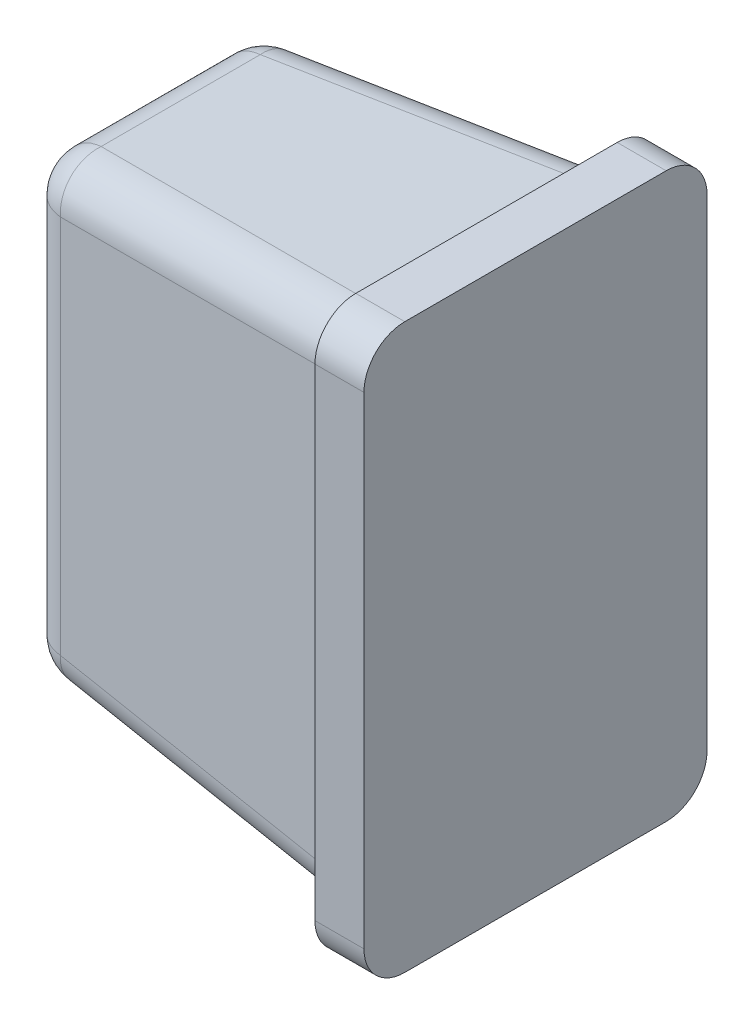
ISO-10303-21;
HEADER;
FILE_DESCRIPTION(('STEP AP214'),'2;1');
FILE_NAME('part.step','',(''),(''),'','','');
FILE_SCHEMA(('AUTOMOTIVE_DESIGN { 1 0 10303 214 1 1 1 1 }'));
ENDSEC;
DATA;
#1=APPLICATION_CONTEXT('core data for automotive mechanical design processes');
#2=APPLICATION_PROTOCOL_DEFINITION('international standard','automotive_design',2000,#1);
#3=PRODUCT_CONTEXT('',#1,'mechanical');
#4=PRODUCT('Part','Part','',(#3));
#5=PRODUCT_RELATED_PRODUCT_CATEGORY('part','',(#4));
#6=PRODUCT_DEFINITION_FORMATION('','',#4);
#7=PRODUCT_DEFINITION_CONTEXT('part definition',#1,'design');
#8=PRODUCT_DEFINITION('design','',#6,#7);
#9=PRODUCT_DEFINITION_SHAPE('','',#8);
#10=(LENGTH_UNIT() NAMED_UNIT(*) SI_UNIT(.MILLI.,.METRE.));
#11=(NAMED_UNIT(*) PLANE_ANGLE_UNIT() SI_UNIT($,.RADIAN.));
#12=(NAMED_UNIT(*) SI_UNIT($,.STERADIAN.) SOLID_ANGLE_UNIT());
#13=UNCERTAINTY_MEASURE_WITH_UNIT(LENGTH_MEASURE(1.E-05),#10,'distance_accuracy_value','');
#14=(GEOMETRIC_REPRESENTATION_CONTEXT(3) GLOBAL_UNCERTAINTY_ASSIGNED_CONTEXT((#13)) GLOBAL_UNIT_ASSIGNED_CONTEXT((#10,
#11,#12)) REPRESENTATION_CONTEXT('',''));
#15=CARTESIAN_POINT('',(0.,0.,0.));
#16=DIRECTION('',(0.,0.,1.));
#17=DIRECTION('',(1.,0.,0.));
#18=AXIS2_PLACEMENT_3D('',#15,#16,#17);
#19=CARTESIAN_POINT('',(-14.4,2.32438202618241,-38.9256179738176));
#20=DIRECTION('',(1.,0.,0.));
#21=DIRECTION('',(0.,0.,-1.));
#22=AXIS2_PLACEMENT_3D('',#19,#20,#21);
#23=SPHERICAL_SURFACE('',#22,0.5);
#24=CARTESIAN_POINT('',(-14.4,2.32438202618241,-38.9256179738176));
#25=DIRECTION('',(0.,0.,-1.));
#26=DIRECTION('',(-1.,0.,0.));
#27=AXIS2_PLACEMENT_3D('',#24,#25,#26);
#28=CIRCLE('',#27,0.5);
#29=CARTESIAN_POINT('',(-14.9,2.32438202618241,-38.9256179738176));
#30=VERTEX_POINT('',#29);
#31=CARTESIAN_POINT('',(-14.4435778713738,2.82247937522828,-38.9256179738176));
#32=VERTEX_POINT('',#31);
#33=EDGE_CURVE('E141',#30,#32,#28,.T.);
#34=ORIENTED_EDGE('',*,*,#33,.F.);
#35=CARTESIAN_POINT('',(-14.4,2.32438202618241,-38.9256179738176));
#36=DIRECTION('',(0.,1.,0.));
#37=DIRECTION('',(0.,0.,1.));
#38=AXIS2_PLACEMENT_3D('',#35,#36,#37);
#39=CIRCLE('',#38,0.5);
#40=CARTESIAN_POINT('',(-14.4435778713738,2.32438202618241,-38.4275206247717));
#41=VERTEX_POINT('',#40);
#42=EDGE_CURVE('E234',#41,#30,#39,.F.);
#43=ORIENTED_EDGE('',*,*,#42,.F.);
#44=CARTESIAN_POINT('',(-14.4,2.32438202618241,-38.9256179738176));
#45=DIRECTION('',(0.992432509138967,0.0868265938642478,0.0868265938642478));
#46=DIRECTION('',(0.0871557427476584,0.,-0.996194698091746));
#47=AXIS2_PLACEMENT_3D('',#44,#45,#46);
#48=CIRCLE('',#47,0.499999999999999);
#49=EDGE_CURVE('E140',#32,#41,#48,.T.);
#50=ORIENTED_EDGE('',*,*,#49,.F.);
#51=EDGE_LOOP('',(#34,#43,#50));
#52=FACE_BOUND('',#51,.T.);
#53=ADVANCED_FACE('F17',(#52),#23,.T.);
#54=CARTESIAN_POINT('',(-14.4,-2.32438202618241,-38.9256179738176));
#55=DIRECTION('',(1.,0.,0.));
#56=DIRECTION('',(0.,0.,-1.));
#57=AXIS2_PLACEMENT_3D('',#54,#55,#56);
#58=SPHERICAL_SURFACE('',#57,0.5);
#59=CARTESIAN_POINT('',(-14.4,-2.32438202618241,-38.9256179738176));
#60=DIRECTION('',(0.992432509138967,-0.0868265938642478,0.0868265938642478));
#61=DIRECTION('',(0.0871557427476584,0.,-0.996194698091746));
#62=AXIS2_PLACEMENT_3D('',#59,#60,#61);
#63=CIRCLE('',#62,0.499999999999999);
#64=CARTESIAN_POINT('',(-14.4435778713738,-2.3243820261824,-38.4275206247717));
#65=VERTEX_POINT('',#64);
#66=CARTESIAN_POINT('',(-14.4435778713738,-2.82247937522828,-38.9256179738176));
#67=VERTEX_POINT('',#66);
#68=EDGE_CURVE('E214',#65,#67,#63,.T.);
#69=ORIENTED_EDGE('',*,*,#68,.F.);
#70=CARTESIAN_POINT('',(-14.4,-2.32438202618241,-38.9256179738176));
#71=DIRECTION('',(0.,1.,0.));
#72=DIRECTION('',(0.,0.,1.));
#73=AXIS2_PLACEMENT_3D('',#70,#71,#72);
#74=CIRCLE('',#73,0.5);
#75=CARTESIAN_POINT('',(-14.9,-2.32438202618241,-38.9256179738176));
#76=VERTEX_POINT('',#75);
#77=EDGE_CURVE('E232',#76,#65,#74,.T.);
#78=ORIENTED_EDGE('',*,*,#77,.F.);
#79=CARTESIAN_POINT('',(-14.4,-2.32438202618241,-38.9256179738176));
#80=DIRECTION('',(0.,0.,1.));
#81=DIRECTION('',(1.,0.,0.));
#82=AXIS2_PLACEMENT_3D('',#79,#80,#81);
#83=CIRCLE('',#82,0.5);
#84=EDGE_CURVE('E219',#67,#76,#83,.F.);
#85=ORIENTED_EDGE('',*,*,#84,.F.);
#86=EDGE_LOOP('',(#69,#78,#85));
#87=FACE_BOUND('',#86,.T.);
#88=ADVANCED_FACE('F269',(#87),#58,.T.);
#89=CARTESIAN_POINT('',(-14.9,0.,0.));
#90=DIRECTION('',(-1.,0.,0.));
#91=DIRECTION('',(0.,0.,1.));
#92=AXIS2_PLACEMENT_3D('',#89,#90,#91);
#93=PLANE('',#92);
#94=DIRECTION('',(0.,0.,-1.));
#95=VECTOR('',#94,1.);
#96=CARTESIAN_POINT('',(-14.9,2.32438202618241,0.));
#97=LINE('',#96,#95);
#98=CARTESIAN_POINT('',(-14.9,2.32438202618241,-40.8743820261824));
#99=VERTEX_POINT('',#98);
#100=EDGE_CURVE('E243',#99,#30,#97,.F.);
#101=ORIENTED_EDGE('',*,*,#100,.F.);
#102=DIRECTION('',(0.,-1.,0.));
#103=VECTOR('',#102,1.);
#104=CARTESIAN_POINT('',(-14.9,0.,-40.8743820261824));
#105=LINE('',#104,#103);
#106=CARTESIAN_POINT('',(-14.9,-2.32438202618241,-40.8743820261824));
#107=VERTEX_POINT('',#106);
#108=EDGE_CURVE('E209',#107,#99,#105,.F.);
#109=ORIENTED_EDGE('',*,*,#108,.F.);
#110=DIRECTION('',(0.,0.,1.));
#111=VECTOR('',#110,1.);
#112=CARTESIAN_POINT('',(-14.9,-2.32438202618241,0.));
#113=LINE('',#112,#111);
#114=EDGE_CURVE('E222',#76,#107,#113,.F.);
#115=ORIENTED_EDGE('',*,*,#114,.F.);
#116=DIRECTION('',(0.,1.,0.));
#117=VECTOR('',#116,1.);
#118=CARTESIAN_POINT('',(-14.9,0.,-38.9256179738176));
#119=LINE('',#118,#117);
#120=EDGE_CURVE('E227',#30,#76,#119,.F.);
#121=ORIENTED_EDGE('',*,*,#120,.F.);
#122=EDGE_LOOP('',(#101,#109,#115,#121));
#123=FACE_BOUND('',#122,.T.);
#124=ADVANCED_FACE('F266',(#123),#93,.T.);
#125=CARTESIAN_POINT('',(-14.4,2.32438202618241,-40.8743820261824));
#126=DIRECTION('',(1.,0.,0.));
#127=DIRECTION('',(0.,0.,-1.));
#128=AXIS2_PLACEMENT_3D('',#125,#126,#127);
#129=SPHERICAL_SURFACE('',#128,0.5);
#130=CARTESIAN_POINT('',(-14.4,2.32438202618241,-40.8743820261824));
#131=DIRECTION('',(0.,-1.,0.));
#132=DIRECTION('',(0.,0.,-1.));
#133=AXIS2_PLACEMENT_3D('',#130,#131,#132);
#134=CIRCLE('',#133,0.5);
#135=CARTESIAN_POINT('',(-14.4435778713738,2.32438202618239,-41.3724793752283));
#136=VERTEX_POINT('',#135);
#137=EDGE_CURVE('E210',#99,#136,#134,.T.);
#138=ORIENTED_EDGE('',*,*,#137,.F.);
#139=CARTESIAN_POINT('',(-14.4,2.32438202618241,-40.8743820261824));
#140=DIRECTION('',(0.,0.,-1.));
#141=DIRECTION('',(-1.,0.,0.));
#142=AXIS2_PLACEMENT_3D('',#139,#140,#141);
#143=CIRCLE('',#142,0.5);
#144=CARTESIAN_POINT('',(-14.4435778713738,2.82247937522828,-40.8743820261824));
#145=VERTEX_POINT('',#144);
#146=EDGE_CURVE('E246',#145,#99,#143,.F.);
#147=ORIENTED_EDGE('',*,*,#146,.F.);
#148=CARTESIAN_POINT('',(-14.4,2.32438202618241,-40.8743820261824));
#149=DIRECTION('',(0.992432509138967,0.0868265938642478,-0.0868265938642478));
#150=DIRECTION('',(-0.0871557427476584,0.,-0.996194698091746));
#151=AXIS2_PLACEMENT_3D('',#148,#149,#150);
#152=CIRCLE('',#151,0.499999999999999);
#153=EDGE_CURVE('E317',#136,#145,#152,.T.);
#154=ORIENTED_EDGE('',*,*,#153,.F.);
#155=EDGE_LOOP('',(#138,#147,#154));
#156=FACE_BOUND('',#155,.T.);
#157=ADVANCED_FACE('F261',(#156),#129,.T.);
#158=CARTESIAN_POINT('',(-14.4,-2.32438202618241,-40.8743820261824));
#159=DIRECTION('',(1.,0.,0.));
#160=DIRECTION('',(0.,0.,-1.));
#161=AXIS2_PLACEMENT_3D('',#158,#159,#160);
#162=SPHERICAL_SURFACE('',#161,0.5);
#163=CARTESIAN_POINT('',(-14.4,-2.32438202618241,-40.8743820261824));
#164=DIRECTION('',(0.992432509138967,-0.0868265938642478,-0.0868265938642478));
#165=DIRECTION('',(-0.0871557427476584,0.,-0.996194698091746));
#166=AXIS2_PLACEMENT_3D('',#163,#164,#165);
#167=CIRCLE('',#166,0.499999999999999);
#168=CARTESIAN_POINT('',(-14.4435778713738,-2.82247937522828,-40.8743820261824));
#169=VERTEX_POINT('',#168);
#170=CARTESIAN_POINT('',(-14.4435778713738,-2.32438202618241,-41.3724793752283));
#171=VERTEX_POINT('',#170);
#172=EDGE_CURVE('E202',#169,#171,#167,.T.);
#173=ORIENTED_EDGE('',*,*,#172,.F.);
#174=CARTESIAN_POINT('',(-14.4,-2.32438202618241,-40.8743820261824));
#175=DIRECTION('',(0.,0.,1.));
#176=DIRECTION('',(1.,0.,0.));
#177=AXIS2_PLACEMENT_3D('',#174,#175,#176);
#178=CIRCLE('',#177,0.5);
#179=EDGE_CURVE('E223',#107,#169,#178,.T.);
#180=ORIENTED_EDGE('',*,*,#179,.F.);
#181=CARTESIAN_POINT('',(-14.4,-2.32438202618241,-40.8743820261824));
#182=DIRECTION('',(0.,-1.,0.));
#183=DIRECTION('',(0.,0.,-1.));
#184=AXIS2_PLACEMENT_3D('',#181,#182,#183);
#185=CIRCLE('',#184,0.5);
#186=EDGE_CURVE('E206',#171,#107,#185,.F.);
#187=ORIENTED_EDGE('',*,*,#186,.F.);
#188=EDGE_LOOP('',(#173,#180,#187));
#189=FACE_BOUND('',#188,.T.);
#190=ADVANCED_FACE('F256',(#189),#162,.T.);
#191=CARTESIAN_POINT('',(-14.4,2.32438202618241,0.));
#192=DIRECTION('',(0.,0.,-1.));
#193=DIRECTION('',(-1.,0.,0.));
#194=AXIS2_PLACEMENT_3D('',#191,#192,#193);
#195=CYLINDRICAL_SURFACE('',#194,0.5);
#196=ORIENTED_EDGE('',*,*,#33,.T.);
#197=DIRECTION('',(0.,0.,1.));
#198=VECTOR('',#197,1.);
#199=CARTESIAN_POINT('',(-14.4435778713738,2.82247937522828,-38.1));
#200=LINE('',#199,#198);
#201=EDGE_CURVE('E149',#145,#32,#200,.T.);
#202=ORIENTED_EDGE('',*,*,#201,.F.);
#203=ORIENTED_EDGE('',*,*,#146,.T.);
#204=ORIENTED_EDGE('',*,*,#100,.T.);
#205=EDGE_LOOP('',(#196,#202,#203,#204));
#206=FACE_BOUND('',#205,.T.);
#207=ADVANCED_FACE('F260',(#206),#195,.T.);
#208=CARTESIAN_POINT('',(-10.6135013119687,2.65565773584093,-38.5943422641591));
#209=DIRECTION('',(0.992432509138967,0.0868265938642478,0.0868265938642478));
#210=DIRECTION('',(0.0871557427476584,0.,-0.996194698091746));
#211=AXIS2_PLACEMENT_3D('',#208,#209,#210);
#212=CYLINDRICAL_SURFACE('',#211,0.499999999999999);
#213=ORIENTED_EDGE('',*,*,#49,.T.);
#214=DIRECTION('',(-0.992432509138967,-0.0868265938642484,-0.0868265938642479));
#215=VECTOR('',#214,1.);
#216=CARTESIAN_POINT('',(-10.7,2.65190265095413,-38.1));
#217=LINE('',#216,#215);
#218=CARTESIAN_POINT('',(-10.7,2.65190265095413,-38.1));
#219=VERTEX_POINT('',#218);
#220=EDGE_CURVE('E138',#219,#41,#217,.T.);
#221=ORIENTED_EDGE('',*,*,#220,.F.);
#222=CARTESIAN_POINT('',(-10.7,2.64809008122833,-38.6019099187717));
#223=DIRECTION('',(-1.,0.,0.));
#224=DIRECTION('',(0.,0.707106781186548,0.707106781186548));
#225=AXIS2_PLACEMENT_3D('',#222,#223,#224);
#226=ELLIPSE('',#225,0.503812597225174,0.499999999999999);
#227=CARTESIAN_POINT('',(-10.7,3.15,-38.5980973490459));
#228=VERTEX_POINT('',#227);
#229=EDGE_CURVE('E21',#219,#228,#226,.T.);
#230=ORIENTED_EDGE('',*,*,#229,.T.);
#231=DIRECTION('',(0.992432509138967,0.0868265938642478,0.0868265938642442));
#232=VECTOR('',#231,1.);
#233=CARTESIAN_POINT('',(-14.4435778713738,2.82247937522828,-38.9256179738176));
#234=LINE('',#233,#232);
#235=EDGE_CURVE('E136',#32,#228,#234,.T.);
#236=ORIENTED_EDGE('',*,*,#235,.F.);
#237=EDGE_LOOP('',(#213,#221,#230,#236));
#238=FACE_BOUND('',#237,.T.);
#239=ADVANCED_FACE('F135',(#238),#212,.T.);
#240=CARTESIAN_POINT('',(-14.4,0.,-38.9256179738176));
#241=DIRECTION('',(0.,1.,0.));
#242=DIRECTION('',(0.,0.,1.));
#243=AXIS2_PLACEMENT_3D('',#240,#241,#242);
#244=CYLINDRICAL_SURFACE('',#243,0.5);
#245=ORIENTED_EDGE('',*,*,#42,.T.);
#246=ORIENTED_EDGE('',*,*,#120,.T.);
#247=ORIENTED_EDGE('',*,*,#77,.T.);
#248=DIRECTION('',(0.,1.,0.));
#249=VECTOR('',#248,1.);
#250=CARTESIAN_POINT('',(-14.4435778713738,-3.15,-38.4275206247717));
#251=LINE('',#250,#249);
#252=EDGE_CURVE('E197',#41,#65,#251,.F.);
#253=ORIENTED_EDGE('',*,*,#252,.F.);
#254=EDGE_LOOP('',(#245,#246,#247,#253));
#255=FACE_BOUND('',#254,.T.);
#256=ADVANCED_FACE('F330',(#255),#244,.T.);
#257=CARTESIAN_POINT('',(-14.4,-2.32438202618241,0.));
#258=DIRECTION('',(0.,0.,1.));
#259=DIRECTION('',(1.,0.,0.));
#260=AXIS2_PLACEMENT_3D('',#257,#258,#259);
#261=CYLINDRICAL_SURFACE('',#260,0.5);
#262=ORIENTED_EDGE('',*,*,#84,.T.);
#263=ORIENTED_EDGE('',*,*,#114,.T.);
#264=ORIENTED_EDGE('',*,*,#179,.T.);
#265=DIRECTION('',(0.,0.,1.));
#266=VECTOR('',#265,1.);
#267=CARTESIAN_POINT('',(-14.4435778713738,-2.82247937522828,-41.7));
#268=LINE('',#267,#266);
#269=EDGE_CURVE('E195',#67,#169,#268,.F.);
#270=ORIENTED_EDGE('',*,*,#269,.F.);
#271=EDGE_LOOP('',(#262,#263,#264,#270));
#272=FACE_BOUND('',#271,.T.);
#273=ADVANCED_FACE('F356',(#272),#261,.T.);
#274=CARTESIAN_POINT('',(-10.6135013119687,-2.65565773584093,-38.5943422641591));
#275=DIRECTION('',(0.992432509138967,-0.0868265938642478,0.0868265938642478));
#276=DIRECTION('',(0.0871557427476584,0.,-0.996194698091746));
#277=AXIS2_PLACEMENT_3D('',#274,#275,#276);
#278=CYLINDRICAL_SURFACE('',#277,0.499999999999999);
#279=ORIENTED_EDGE('',*,*,#68,.T.);
#280=DIRECTION('',(-0.992432509138967,0.0868265938642478,-0.0868265938642442));
#281=VECTOR('',#280,1.);
#282=CARTESIAN_POINT('',(-10.7,-3.15,-38.5980973490459));
#283=LINE('',#282,#281);
#284=CARTESIAN_POINT('',(-10.7,-3.15,-38.5980973490459));
#285=VERTEX_POINT('',#284);
#286=EDGE_CURVE('E189',#285,#67,#283,.T.);
#287=ORIENTED_EDGE('',*,*,#286,.F.);
#288=CARTESIAN_POINT('',(-10.7,-2.64809008122833,-38.6019099187717));
#289=DIRECTION('',(-1.,0.,0.));
#290=DIRECTION('',(0.,-0.707106781186548,0.707106781186548));
#291=AXIS2_PLACEMENT_3D('',#288,#289,#290);
#292=ELLIPSE('',#291,0.503812597225174,0.499999999999999);
#293=CARTESIAN_POINT('',(-10.7,-2.65190265095413,-38.1));
#294=VERTEX_POINT('',#293);
#295=EDGE_CURVE('E280',#285,#294,#292,.T.);
#296=ORIENTED_EDGE('',*,*,#295,.T.);
#297=DIRECTION('',(0.992432509138967,-0.0868265938642484,0.0868265938642479));
#298=VECTOR('',#297,1.);
#299=CARTESIAN_POINT('',(-14.4435778713738,-2.32438202618241,-38.4275206247717));
#300=LINE('',#299,#298);
#301=EDGE_CURVE('E198',#65,#294,#300,.T.);
#302=ORIENTED_EDGE('',*,*,#301,.F.);
#303=EDGE_LOOP('',(#279,#287,#296,#302));
#304=FACE_BOUND('',#303,.T.);
#305=ADVANCED_FACE('F586',(#304),#278,.T.);
#306=CARTESIAN_POINT('',(-14.4,0.,-40.8743820261824));
#307=DIRECTION('',(0.,-1.,0.));
#308=DIRECTION('',(0.,0.,-1.));
#309=AXIS2_PLACEMENT_3D('',#306,#307,#308);
#310=CYLINDRICAL_SURFACE('',#309,0.5);
#311=ORIENTED_EDGE('',*,*,#186,.T.);
#312=ORIENTED_EDGE('',*,*,#108,.T.);
#313=ORIENTED_EDGE('',*,*,#137,.T.);
#314=DIRECTION('',(0.,1.,0.));
#315=VECTOR('',#314,1.);
#316=CARTESIAN_POINT('',(-14.4435778713738,3.15,-41.3724793752283));
#317=LINE('',#316,#315);
#318=EDGE_CURVE('E188',#171,#136,#317,.T.);
#319=ORIENTED_EDGE('',*,*,#318,.F.);
#320=EDGE_LOOP('',(#311,#312,#313,#319));
#321=FACE_BOUND('',#320,.T.);
#322=ADVANCED_FACE('F351',(#321),#310,.T.);
#323=CARTESIAN_POINT('',(-10.6135013119687,2.65565773584093,-41.2056577358409));
#324=DIRECTION('',(0.992432509138967,0.0868265938642478,-0.0868265938642478));
#325=DIRECTION('',(-0.0871557427476584,0.,-0.996194698091746));
#326=AXIS2_PLACEMENT_3D('',#323,#324,#325);
#327=CYLINDRICAL_SURFACE('',#326,0.499999999999999);
#328=ORIENTED_EDGE('',*,*,#153,.T.);
#329=DIRECTION('',(-0.992432509138968,-0.0868265938642478,0.0868265938642424));
#330=VECTOR('',#329,1.);
#331=CARTESIAN_POINT('',(-10.7,3.15,-41.2019026509541));
#332=LINE('',#331,#330);
#333=CARTESIAN_POINT('',(-10.7,3.15,-41.2019026509541));
#334=VERTEX_POINT('',#333);
#335=EDGE_CURVE('E201',#334,#145,#332,.T.);
#336=ORIENTED_EDGE('',*,*,#335,.F.);
#337=CARTESIAN_POINT('',(-10.7,2.64809008122833,-41.1980900812283));
#338=DIRECTION('',(-1.,0.,0.));
#339=DIRECTION('',(0.,0.707106781186548,-0.707106781186548));
#340=AXIS2_PLACEMENT_3D('',#337,#338,#339);
#341=ELLIPSE('',#340,0.503812597225174,0.499999999999999);
#342=CARTESIAN_POINT('',(-10.7,2.65190265095413,-41.7));
#343=VERTEX_POINT('',#342);
#344=EDGE_CURVE('E155',#334,#343,#341,.T.);
#345=ORIENTED_EDGE('',*,*,#344,.T.);
#346=DIRECTION('',(0.992432509138967,0.0868265938642484,-0.0868265938642479));
#347=VECTOR('',#346,1.);
#348=CARTESIAN_POINT('',(-14.4435778713738,2.32438202618241,-41.3724793752283));
#349=LINE('',#348,#347);
#350=EDGE_CURVE('E163',#136,#343,#349,.T.);
#351=ORIENTED_EDGE('',*,*,#350,.F.);
#352=EDGE_LOOP('',(#328,#336,#345,#351));
#353=FACE_BOUND('',#352,.T.);
#354=ADVANCED_FACE('F567',(#353),#327,.T.);
#355=CARTESIAN_POINT('',(-10.6135013119687,-2.65565773584093,-41.2056577358409));
#356=DIRECTION('',(0.992432509138967,-0.0868265938642478,-0.0868265938642478));
#357=DIRECTION('',(-0.0871557427476584,0.,-0.996194698091746));
#358=AXIS2_PLACEMENT_3D('',#355,#356,#357);
#359=CYLINDRICAL_SURFACE('',#358,0.499999999999999);
#360=ORIENTED_EDGE('',*,*,#172,.T.);
#361=DIRECTION('',(-0.992432509138967,0.0868265938642484,0.0868265938642479));
#362=VECTOR('',#361,1.);
#363=CARTESIAN_POINT('',(-10.7,-2.65190265095413,-41.7));
#364=LINE('',#363,#362);
#365=CARTESIAN_POINT('',(-10.7,-2.65190265095413,-41.7));
#366=VERTEX_POINT('',#365);
#367=EDGE_CURVE('E158',#366,#171,#364,.T.);
#368=ORIENTED_EDGE('',*,*,#367,.F.);
#369=CARTESIAN_POINT('',(-10.7,-2.64809008122833,-41.1980900812283));
#370=DIRECTION('',(-1.,0.,0.));
#371=DIRECTION('',(0.,-0.707106781186548,-0.707106781186548));
#372=AXIS2_PLACEMENT_3D('',#369,#370,#371);
#373=ELLIPSE('',#372,0.503812597225174,0.499999999999999);
#374=CARTESIAN_POINT('',(-10.7,-3.15,-41.2019026509541));
#375=VERTEX_POINT('',#374);
#376=EDGE_CURVE('E315',#366,#375,#373,.T.);
#377=ORIENTED_EDGE('',*,*,#376,.T.);
#378=DIRECTION('',(0.992432509138968,-0.0868265938642478,-0.0868265938642424));
#379=VECTOR('',#378,1.);
#380=CARTESIAN_POINT('',(-14.4435778713738,-2.82247937522828,-40.8743820261824));
#381=LINE('',#380,#379);
#382=EDGE_CURVE('E192',#169,#375,#381,.T.);
#383=ORIENTED_EDGE('',*,*,#382,.F.);
#384=EDGE_LOOP('',(#360,#368,#377,#383));
#385=FACE_BOUND('',#384,.T.);
#386=ADVANCED_FACE('F366',(#385),#359,.T.);
#387=CARTESIAN_POINT('',(-10.7,3.15,-38.1));
#388=DIRECTION('',(-0.0871557427476584,0.996194698091746,0.));
#389=DIRECTION('',(-0.996194698091746,-0.0871557427476584,0.));
#390=AXIS2_PLACEMENT_3D('',#387,#388,#389);
#391=PLANE('',#390);
#392=ORIENTED_EDGE('',*,*,#201,.T.);
#393=ORIENTED_EDGE('',*,*,#235,.T.);
#394=DIRECTION('',(0.,0.,1.));
#395=VECTOR('',#394,1.);
#396=CARTESIAN_POINT('',(-10.7,3.15,0.));
#397=LINE('',#396,#395);
#398=EDGE_CURVE('E147',#334,#228,#397,.T.);
#399=ORIENTED_EDGE('',*,*,#398,.F.);
#400=ORIENTED_EDGE('',*,*,#335,.T.);
#401=EDGE_LOOP('',(#392,#393,#399,#400));
#402=FACE_BOUND('',#401,.T.);
#403=ADVANCED_FACE('F145',(#402),#391,.T.);
#404=CARTESIAN_POINT('',(-10.7,-3.15,-38.1));
#405=DIRECTION('',(-0.0871557427476584,0.,0.996194698091746));
#406=DIRECTION('',(0.996194698091746,0.,0.0871557427476584));
#407=AXIS2_PLACEMENT_3D('',#404,#405,#406);
#408=PLANE('',#407);
#409=ORIENTED_EDGE('',*,*,#252,.T.);
#410=ORIENTED_EDGE('',*,*,#301,.T.);
#411=DIRECTION('',(0.,1.,0.));
#412=VECTOR('',#411,1.);
#413=CARTESIAN_POINT('',(-10.7,0.,-38.1));
#414=LINE('',#413,#412);
#415=EDGE_CURVE('E157',#219,#294,#414,.F.);
#416=ORIENTED_EDGE('',*,*,#415,.F.);
#417=ORIENTED_EDGE('',*,*,#220,.T.);
#418=EDGE_LOOP('',(#409,#410,#416,#417));
#419=FACE_BOUND('',#418,.T.);
#420=ADVANCED_FACE('F325',(#419),#408,.T.);
#421=CARTESIAN_POINT('',(-10.7,-3.15,-41.7));
#422=DIRECTION('',(-0.0871557427476584,-0.996194698091746,0.));
#423=DIRECTION('',(0.996194698091746,-0.0871557427476584,0.));
#424=AXIS2_PLACEMENT_3D('',#421,#422,#423);
#425=PLANE('',#424);
#426=DIRECTION('',(0.,0.,1.));
#427=VECTOR('',#426,1.);
#428=CARTESIAN_POINT('',(-10.7,-3.15,0.));
#429=LINE('',#428,#427);
#430=EDGE_CURVE('E160',#285,#375,#429,.F.);
#431=ORIENTED_EDGE('',*,*,#430,.F.);
#432=ORIENTED_EDGE('',*,*,#286,.T.);
#433=ORIENTED_EDGE('',*,*,#269,.T.);
#434=ORIENTED_EDGE('',*,*,#382,.T.);
#435=EDGE_LOOP('',(#431,#432,#433,#434));
#436=FACE_BOUND('',#435,.T.);
#437=ADVANCED_FACE('F360',(#436),#425,.T.);
#438=CARTESIAN_POINT('',(-10.7,3.15,-41.7));
#439=DIRECTION('',(-0.0871557427476584,0.,-0.996194698091746));
#440=DIRECTION('',(-0.996194698091746,0.,0.0871557427476584));
#441=AXIS2_PLACEMENT_3D('',#438,#439,#440);
#442=PLANE('',#441);
#443=DIRECTION('',(0.,1.,0.));
#444=VECTOR('',#443,1.);
#445=CARTESIAN_POINT('',(-10.7,0.,-41.7));
#446=LINE('',#445,#444);
#447=EDGE_CURVE('E313',#366,#343,#446,.T.);
#448=ORIENTED_EDGE('',*,*,#447,.F.);
#449=ORIENTED_EDGE('',*,*,#367,.T.);
#450=ORIENTED_EDGE('',*,*,#318,.T.);
#451=ORIENTED_EDGE('',*,*,#350,.T.);
#452=EDGE_LOOP('',(#448,#449,#450,#451));
#453=FACE_BOUND('',#452,.T.);
#454=ADVANCED_FACE('F419',(#453),#442,.T.);
#455=CARTESIAN_POINT('',(-10.7,0.,0.));
#456=DIRECTION('',(-1.,0.,0.));
#457=DIRECTION('',(0.,0.,1.));
#458=AXIS2_PLACEMENT_3D('',#455,#456,#457);
#459=PLANE('',#458);
#460=ORIENTED_EDGE('',*,*,#447,.T.);
#461=ORIENTED_EDGE('',*,*,#344,.F.);
#462=ORIENTED_EDGE('',*,*,#398,.T.);
#463=ORIENTED_EDGE('',*,*,#229,.F.);
#464=ORIENTED_EDGE('',*,*,#415,.T.);
#465=ORIENTED_EDGE('',*,*,#295,.F.);
#466=ORIENTED_EDGE('',*,*,#430,.T.);
#467=ORIENTED_EDGE('',*,*,#376,.F.);
#468=EDGE_LOOP('',(#460,#461,#462,#463,#464,#465,#466,#467));
#469=FACE_BOUND('',#468,.T.);
#470=DIRECTION('',(0.,1.,0.));
#471=VECTOR('',#470,1.);
#472=CARTESIAN_POINT('',(-10.7,3.45,-37.8));
#473=LINE('',#472,#471);
#474=CARTESIAN_POINT('',(-10.7,-2.95,-37.8));
#475=VERTEX_POINT('',#474);
#476=CARTESIAN_POINT('',(-10.7,2.95,-37.8));
#477=VERTEX_POINT('',#476);
#478=EDGE_CURVE('E176',#475,#477,#473,.T.);
#479=ORIENTED_EDGE('',*,*,#478,.T.);
#480=CARTESIAN_POINT('',(-10.7,2.95,-38.3));
#481=DIRECTION('',(1.,0.,0.));
#482=DIRECTION('',(0.,0.,-1.));
#483=AXIS2_PLACEMENT_3D('',#480,#481,#482);
#484=CIRCLE('',#483,0.5);
#485=CARTESIAN_POINT('',(-10.7,3.45,-38.3));
#486=VERTEX_POINT('',#485);
#487=EDGE_CURVE('E179',#486,#477,#484,.T.);
#488=ORIENTED_EDGE('',*,*,#487,.F.);
#489=DIRECTION('',(0.,0.,-1.));
#490=VECTOR('',#489,1.);
#491=CARTESIAN_POINT('',(-10.7,3.45,-42.));
#492=LINE('',#491,#490);
#493=CARTESIAN_POINT('',(-10.7,3.45,-41.5));
#494=VERTEX_POINT('',#493);
#495=EDGE_CURVE('E171',#486,#494,#492,.T.);
#496=ORIENTED_EDGE('',*,*,#495,.T.);
#497=CARTESIAN_POINT('',(-10.7,2.95,-41.5));
#498=DIRECTION('',(1.,0.,0.));
#499=DIRECTION('',(0.,0.,-1.));
#500=AXIS2_PLACEMENT_3D('',#497,#498,#499);
#501=CIRCLE('',#500,0.5);
#502=CARTESIAN_POINT('',(-10.7,2.95,-42.));
#503=VERTEX_POINT('',#502);
#504=EDGE_CURVE('E174',#503,#494,#501,.T.);
#505=ORIENTED_EDGE('',*,*,#504,.F.);
#506=DIRECTION('',(0.,1.,0.));
#507=VECTOR('',#506,1.);
#508=CARTESIAN_POINT('',(-10.7,3.45,-42.));
#509=LINE('',#508,#507);
#510=CARTESIAN_POINT('',(-10.7,-2.95,-42.));
#511=VERTEX_POINT('',#510);
#512=EDGE_CURVE('E167',#503,#511,#509,.F.);
#513=ORIENTED_EDGE('',*,*,#512,.T.);
#514=CARTESIAN_POINT('',(-10.7,-2.95,-41.5));
#515=DIRECTION('',(1.,0.,0.));
#516=DIRECTION('',(0.,0.,-1.));
#517=AXIS2_PLACEMENT_3D('',#514,#515,#516);
#518=CIRCLE('',#517,0.5);
#519=CARTESIAN_POINT('',(-10.7,-3.45,-41.5));
#520=VERTEX_POINT('',#519);
#521=EDGE_CURVE('E311',#520,#511,#518,.T.);
#522=ORIENTED_EDGE('',*,*,#521,.F.);
#523=DIRECTION('',(0.,0.,1.));
#524=VECTOR('',#523,1.);
#525=CARTESIAN_POINT('',(-10.7,-3.45,-42.));
#526=LINE('',#525,#524);
#527=CARTESIAN_POINT('',(-10.7,-3.45,-38.3));
#528=VERTEX_POINT('',#527);
#529=EDGE_CURVE('E181',#520,#528,#526,.T.);
#530=ORIENTED_EDGE('',*,*,#529,.T.);
#531=CARTESIAN_POINT('',(-10.7,-2.95,-38.3));
#532=DIRECTION('',(1.,0.,0.));
#533=DIRECTION('',(0.,0.,-1.));
#534=AXIS2_PLACEMENT_3D('',#531,#532,#533);
#535=CIRCLE('',#534,0.5);
#536=EDGE_CURVE('E183',#475,#528,#535,.T.);
#537=ORIENTED_EDGE('',*,*,#536,.F.);
#538=EDGE_LOOP('',(#479,#488,#496,#505,#513,#522,#530,#537));
#539=FACE_BOUND('',#538,.T.);
#540=ADVANCED_FACE('F153',(#469,#539),#459,.T.);
#541=CARTESIAN_POINT('',(-10.7,-2.95,-41.5));
#542=DIRECTION('',(1.,0.,0.));
#543=DIRECTION('',(0.,0.,-1.));
#544=AXIS2_PLACEMENT_3D('',#541,#542,#543);
#545=CYLINDRICAL_SURFACE('',#544,0.5);
#546=CARTESIAN_POINT('',(-10.1,-2.95,-41.5));
#547=DIRECTION('',(1.,0.,0.));
#548=DIRECTION('',(0.,0.,-1.));
#549=AXIS2_PLACEMENT_3D('',#546,#547,#548);
#550=CIRCLE('',#549,0.5);
#551=CARTESIAN_POINT('',(-10.1,-2.95,-42.));
#552=VERTEX_POINT('',#551);
#553=CARTESIAN_POINT('',(-10.1,-3.45,-41.5));
#554=VERTEX_POINT('',#553);
#555=EDGE_CURVE('E170',#552,#554,#550,.F.);
#556=ORIENTED_EDGE('',*,*,#555,.T.);
#557=DIRECTION('',(1.,0.,0.));
#558=VECTOR('',#557,1.);
#559=CARTESIAN_POINT('',(-10.7,-3.45,-41.5));
#560=LINE('',#559,#558);
#561=EDGE_CURVE('E184',#554,#520,#560,.F.);
#562=ORIENTED_EDGE('',*,*,#561,.T.);
#563=ORIENTED_EDGE('',*,*,#521,.T.);
#564=DIRECTION('',(1.,0.,0.));
#565=VECTOR('',#564,1.);
#566=CARTESIAN_POINT('',(-10.7,-2.95,-42.));
#567=LINE('',#566,#565);
#568=EDGE_CURVE('E379',#511,#552,#567,.T.);
#569=ORIENTED_EDGE('',*,*,#568,.T.);
#570=EDGE_LOOP('',(#556,#562,#563,#569));
#571=FACE_BOUND('',#570,.T.);
#572=ADVANCED_FACE('F413',(#571),#545,.T.);
#573=CARTESIAN_POINT('',(-10.7,-3.45,-42.));
#574=DIRECTION('',(0.,1.,0.));
#575=DIRECTION('',(0.,0.,1.));
#576=AXIS2_PLACEMENT_3D('',#573,#574,#575);
#577=PLANE('',#576);
#578=ORIENTED_EDGE('',*,*,#561,.F.);
#579=DIRECTION('',(0.,0.,1.));
#580=VECTOR('',#579,1.);
#581=CARTESIAN_POINT('',(-10.1,-3.45,0.));
#582=LINE('',#581,#580);
#583=CARTESIAN_POINT('',(-10.1,-3.45,-38.3));
#584=VERTEX_POINT('',#583);
#585=EDGE_CURVE('E302',#554,#584,#582,.T.);
#586=ORIENTED_EDGE('',*,*,#585,.T.);
#587=DIRECTION('',(1.,0.,0.));
#588=VECTOR('',#587,1.);
#589=CARTESIAN_POINT('',(-10.7,-3.45,-38.3));
#590=LINE('',#589,#588);
#591=EDGE_CURVE('E310',#528,#584,#590,.T.);
#592=ORIENTED_EDGE('',*,*,#591,.F.);
#593=ORIENTED_EDGE('',*,*,#529,.F.);
#594=EDGE_LOOP('',(#578,#586,#592,#593));
#595=FACE_BOUND('',#594,.T.);
#596=ADVANCED_FACE('F411',(#595),#577,.F.);
#597=CARTESIAN_POINT('',(-10.7,-2.95,-38.3));
#598=DIRECTION('',(1.,0.,0.));
#599=DIRECTION('',(0.,0.,-1.));
#600=AXIS2_PLACEMENT_3D('',#597,#598,#599);
#601=CYLINDRICAL_SURFACE('',#600,0.5);
#602=CARTESIAN_POINT('',(-10.1,-2.95,-38.3));
#603=DIRECTION('',(1.,0.,0.));
#604=DIRECTION('',(0.,0.,-1.));
#605=AXIS2_PLACEMENT_3D('',#602,#603,#604);
#606=CIRCLE('',#605,0.5);
#607=CARTESIAN_POINT('',(-10.1,-2.95,-37.8));
#608=VERTEX_POINT('',#607);
#609=EDGE_CURVE('E299',#584,#608,#606,.F.);
#610=ORIENTED_EDGE('',*,*,#609,.T.);
#611=DIRECTION('',(-1.,0.,0.));
#612=VECTOR('',#611,1.);
#613=CARTESIAN_POINT('',(-10.7,-2.95,-37.8));
#614=LINE('',#613,#612);
#615=EDGE_CURVE('E180',#608,#475,#614,.T.);
#616=ORIENTED_EDGE('',*,*,#615,.T.);
#617=ORIENTED_EDGE('',*,*,#536,.T.);
#618=ORIENTED_EDGE('',*,*,#591,.T.);
#619=EDGE_LOOP('',(#610,#616,#617,#618));
#620=FACE_BOUND('',#619,.T.);
#621=ADVANCED_FACE('F407',(#620),#601,.T.);
#622=CARTESIAN_POINT('',(-10.7,3.45,-37.8));
#623=DIRECTION('',(0.,0.,-1.));
#624=DIRECTION('',(-1.,0.,0.));
#625=AXIS2_PLACEMENT_3D('',#622,#623,#624);
#626=PLANE('',#625);
#627=DIRECTION('',(1.,0.,0.));
#628=VECTOR('',#627,1.);
#629=CARTESIAN_POINT('',(-10.7,2.95,-37.8));
#630=LINE('',#629,#628);
#631=CARTESIAN_POINT('',(-10.1,2.95,-37.8));
#632=VERTEX_POINT('',#631);
#633=EDGE_CURVE('E308',#477,#632,#630,.T.);
#634=ORIENTED_EDGE('',*,*,#633,.F.);
#635=ORIENTED_EDGE('',*,*,#478,.F.);
#636=ORIENTED_EDGE('',*,*,#615,.F.);
#637=DIRECTION('',(0.,1.,0.));
#638=VECTOR('',#637,1.);
#639=CARTESIAN_POINT('',(-10.1,0.,-37.8));
#640=LINE('',#639,#638);
#641=EDGE_CURVE('E298',#608,#632,#640,.T.);
#642=ORIENTED_EDGE('',*,*,#641,.T.);
#643=EDGE_LOOP('',(#634,#635,#636,#642));
#644=FACE_BOUND('',#643,.T.);
#645=ADVANCED_FACE('F403',(#644),#626,.F.);
#646=CARTESIAN_POINT('',(-10.7,2.95,-38.3));
#647=DIRECTION('',(1.,0.,0.));
#648=DIRECTION('',(0.,0.,-1.));
#649=AXIS2_PLACEMENT_3D('',#646,#647,#648);
#650=CYLINDRICAL_SURFACE('',#649,0.5);
#651=CARTESIAN_POINT('',(-10.1,2.95,-38.3));
#652=DIRECTION('',(1.,0.,0.));
#653=DIRECTION('',(0.,0.,-1.));
#654=AXIS2_PLACEMENT_3D('',#651,#652,#653);
#655=CIRCLE('',#654,0.5);
#656=CARTESIAN_POINT('',(-10.1,3.45,-38.3));
#657=VERTEX_POINT('',#656);
#658=EDGE_CURVE('E295',#632,#657,#655,.F.);
#659=ORIENTED_EDGE('',*,*,#658,.T.);
#660=DIRECTION('',(1.,0.,0.));
#661=VECTOR('',#660,1.);
#662=CARTESIAN_POINT('',(-10.7,3.45,-38.3));
#663=LINE('',#662,#661);
#664=EDGE_CURVE('E175',#657,#486,#663,.F.);
#665=ORIENTED_EDGE('',*,*,#664,.T.);
#666=ORIENTED_EDGE('',*,*,#487,.T.);
#667=ORIENTED_EDGE('',*,*,#633,.T.);
#668=EDGE_LOOP('',(#659,#665,#666,#667));
#669=FACE_BOUND('',#668,.T.);
#670=ADVANCED_FACE('F399',(#669),#650,.T.);
#671=CARTESIAN_POINT('',(-10.7,3.45,-42.));
#672=DIRECTION('',(0.,-1.,0.));
#673=DIRECTION('',(0.,0.,-1.));
#674=AXIS2_PLACEMENT_3D('',#671,#672,#673);
#675=PLANE('',#674);
#676=DIRECTION('',(1.,0.,0.));
#677=VECTOR('',#676,1.);
#678=CARTESIAN_POINT('',(-10.7,3.45,-41.5));
#679=LINE('',#678,#677);
#680=CARTESIAN_POINT('',(-10.1,3.45,-41.5));
#681=VERTEX_POINT('',#680);
#682=EDGE_CURVE('E306',#494,#681,#679,.T.);
#683=ORIENTED_EDGE('',*,*,#682,.F.);
#684=ORIENTED_EDGE('',*,*,#495,.F.);
#685=ORIENTED_EDGE('',*,*,#664,.F.);
#686=DIRECTION('',(0.,0.,1.));
#687=VECTOR('',#686,1.);
#688=CARTESIAN_POINT('',(-10.1,3.45,0.));
#689=LINE('',#688,#687);
#690=EDGE_CURVE('E294',#657,#681,#689,.F.);
#691=ORIENTED_EDGE('',*,*,#690,.T.);
#692=EDGE_LOOP('',(#683,#684,#685,#691));
#693=FACE_BOUND('',#692,.T.);
#694=ADVANCED_FACE('F391',(#693),#675,.F.);
#695=CARTESIAN_POINT('',(-10.7,2.95,-41.5));
#696=DIRECTION('',(1.,0.,0.));
#697=DIRECTION('',(0.,0.,-1.));
#698=AXIS2_PLACEMENT_3D('',#695,#696,#697);
#699=CYLINDRICAL_SURFACE('',#698,0.5);
#700=CARTESIAN_POINT('',(-10.1,2.95,-41.5));
#701=DIRECTION('',(1.,0.,0.));
#702=DIRECTION('',(0.,0.,-1.));
#703=AXIS2_PLACEMENT_3D('',#700,#701,#702);
#704=CIRCLE('',#703,0.5);
#705=CARTESIAN_POINT('',(-10.1,2.95,-42.));
#706=VERTEX_POINT('',#705);
#707=EDGE_CURVE('E27',#681,#706,#704,.F.);
#708=ORIENTED_EDGE('',*,*,#707,.T.);
#709=DIRECTION('',(1.,0.,0.));
#710=VECTOR('',#709,1.);
#711=CARTESIAN_POINT('',(-10.7,2.95,-42.));
#712=LINE('',#711,#710);
#713=EDGE_CURVE('E35',#706,#503,#712,.F.);
#714=ORIENTED_EDGE('',*,*,#713,.T.);
#715=ORIENTED_EDGE('',*,*,#504,.T.);
#716=ORIENTED_EDGE('',*,*,#682,.T.);
#717=EDGE_LOOP('',(#708,#714,#715,#716));
#718=FACE_BOUND('',#717,.T.);
#719=ADVANCED_FACE('F417',(#718),#699,.T.);
#720=CARTESIAN_POINT('',(-10.7,3.45,-42.));
#721=DIRECTION('',(0.,0.,1.));
#722=DIRECTION('',(1.,0.,0.));
#723=AXIS2_PLACEMENT_3D('',#720,#721,#722);
#724=PLANE('',#723);
#725=ORIENTED_EDGE('',*,*,#713,.F.);
#726=DIRECTION('',(0.,1.,0.));
#727=VECTOR('',#726,1.);
#728=CARTESIAN_POINT('',(-10.1,0.,-42.));
#729=LINE('',#728,#727);
#730=EDGE_CURVE('E11',#706,#552,#729,.F.);
#731=ORIENTED_EDGE('',*,*,#730,.T.);
#732=ORIENTED_EDGE('',*,*,#568,.F.);
#733=ORIENTED_EDGE('',*,*,#512,.F.);
#734=EDGE_LOOP('',(#725,#731,#732,#733));
#735=FACE_BOUND('',#734,.T.);
#736=ADVANCED_FACE('F415',(#735),#724,.F.);
#737=CARTESIAN_POINT('',(-10.1,0.,0.));
#738=DIRECTION('',(-1.,0.,0.));
#739=DIRECTION('',(0.,0.,1.));
#740=AXIS2_PLACEMENT_3D('',#737,#738,#739);
#741=PLANE('',#740);
#742=ORIENTED_EDGE('',*,*,#707,.F.);
#743=ORIENTED_EDGE('',*,*,#690,.F.);
#744=ORIENTED_EDGE('',*,*,#658,.F.);
#745=ORIENTED_EDGE('',*,*,#641,.F.);
#746=ORIENTED_EDGE('',*,*,#609,.F.);
#747=ORIENTED_EDGE('',*,*,#585,.F.);
#748=ORIENTED_EDGE('',*,*,#555,.F.);
#749=ORIENTED_EDGE('',*,*,#730,.F.);
#750=EDGE_LOOP('',(#742,#743,#744,#745,#746,#747,#748,#749));
#751=FACE_BOUND('',#750,.T.);
#752=ADVANCED_FACE('F396',(#751),#741,.F.);
#753=CLOSED_SHELL('',(#53,#88,#124,#157,#190,#207,#239,#256,#273,#305,#322,#354,#386,#403,#420,
#437,#454,#540,#572,#596,#621,#645,#670,#694,#719,#736,#752));
#754=MANIFOLD_SOLID_BREP('B1',#753);
#755=ADVANCED_BREP_SHAPE_REPRESENTATION('',(#18,#754),#14);
#756=SHAPE_DEFINITION_REPRESENTATION(#9,#755);
ENDSEC;
END-ISO-10303-21;
